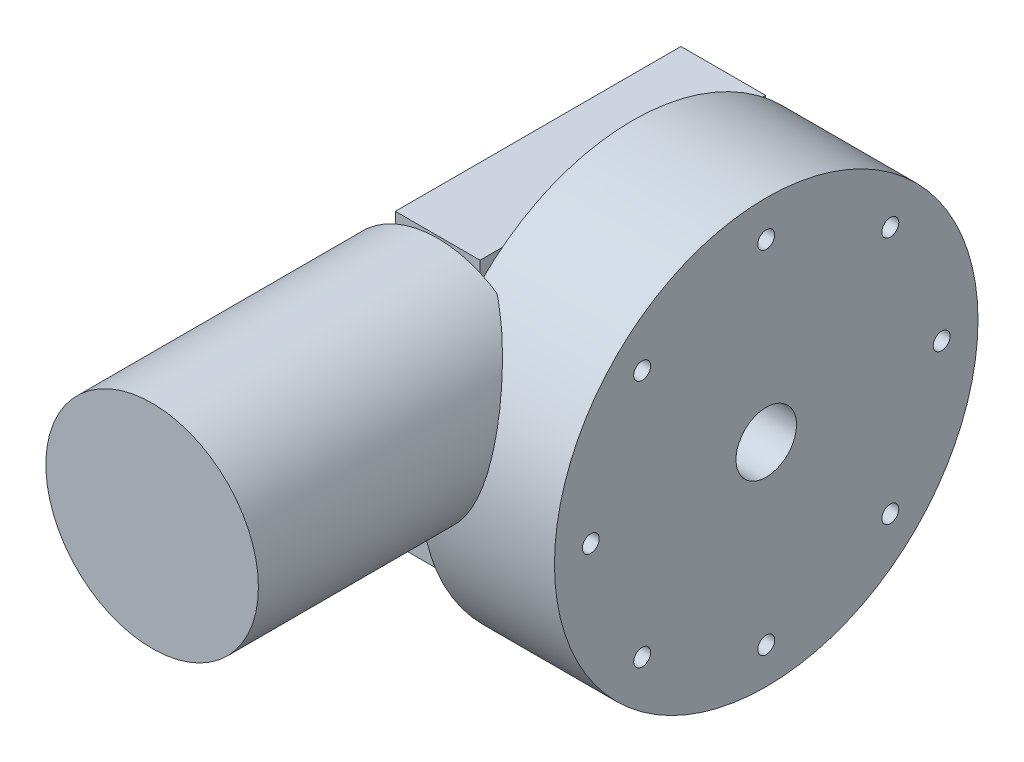
ISO-10303-21;
HEADER;
FILE_DESCRIPTION(('STEP AP214'),'2;1');
FILE_NAME('part.step','',(''),(''),'','','');
FILE_SCHEMA(('AUTOMOTIVE_DESIGN { 1 0 10303 214 1 1 1 1 }'));
ENDSEC;
DATA;
#1=APPLICATION_CONTEXT('core data for automotive mechanical design processes');
#2=APPLICATION_PROTOCOL_DEFINITION('international standard','automotive_design',2000,#1);
#3=PRODUCT_CONTEXT('',#1,'mechanical');
#4=PRODUCT('Part','Part','',(#3));
#5=PRODUCT_RELATED_PRODUCT_CATEGORY('part','',(#4));
#6=PRODUCT_DEFINITION_FORMATION('','',#4);
#7=PRODUCT_DEFINITION_CONTEXT('part definition',#1,'design');
#8=PRODUCT_DEFINITION('design','',#6,#7);
#9=PRODUCT_DEFINITION_SHAPE('','',#8);
#10=(LENGTH_UNIT() NAMED_UNIT(*) SI_UNIT(.MILLI.,.METRE.));
#11=(NAMED_UNIT(*) PLANE_ANGLE_UNIT() SI_UNIT($,.RADIAN.));
#12=(NAMED_UNIT(*) SI_UNIT($,.STERADIAN.) SOLID_ANGLE_UNIT());
#13=UNCERTAINTY_MEASURE_WITH_UNIT(LENGTH_MEASURE(1.E-05),#10,'distance_accuracy_value','');
#14=(GEOMETRIC_REPRESENTATION_CONTEXT(3) GLOBAL_UNCERTAINTY_ASSIGNED_CONTEXT((#13)) GLOBAL_UNIT_ASSIGNED_CONTEXT((#10,
#11,#12)) REPRESENTATION_CONTEXT('',''));
#15=CARTESIAN_POINT('',(0.,0.,0.));
#16=DIRECTION('',(0.,0.,1.));
#17=DIRECTION('',(1.,0.,0.));
#18=AXIS2_PLACEMENT_3D('',#15,#16,#17);
#19=CARTESIAN_POINT('',(-70.,-100.523478567222,126.));
#20=DIRECTION('',(0.,0.,1.));
#21=DIRECTION('',(1.,0.,0.));
#22=AXIS2_PLACEMENT_3D('',#19,#20,#21);
#23=PLANE('',#22);
#24=CARTESIAN_POINT('',(-35.,48.3972012518398,126.));
#25=DIRECTION('',(0.,0.,1.));
#26=DIRECTION('',(1.,0.,0.));
#27=AXIS2_PLACEMENT_3D('',#24,#25,#26);
#28=CIRCLE('',#27,87.8280680463615);
#29=CARTESIAN_POINT('',(0.,128.950100248439,126.));
#30=VERTEX_POINT('',#29);
#31=CARTESIAN_POINT('',(-70.,128.950100248439,126.));
#32=VERTEX_POINT('',#31);
#33=EDGE_CURVE('E53',#30,#32,#28,.T.);
#34=ORIENTED_EDGE('',*,*,#33,.F.);
#35=DIRECTION('',(0.,-1.,0.));
#36=VECTOR('',#35,1.);
#37=CARTESIAN_POINT('',(0.,-100.523478567222,126.));
#38=LINE('',#37,#36);
#39=CARTESIAN_POINT('',(0.,138.,126.));
#40=VERTEX_POINT('',#39);
#41=EDGE_CURVE('E107',#40,#30,#38,.T.);
#42=ORIENTED_EDGE('',*,*,#41,.F.);
#43=DIRECTION('',(1.,0.,0.));
#44=VECTOR('',#43,1.);
#45=CARTESIAN_POINT('',(-70.,138.,126.));
#46=LINE('',#45,#44);
#47=CARTESIAN_POINT('',(-70.,138.,126.));
#48=VERTEX_POINT('',#47);
#49=EDGE_CURVE('E150',#48,#40,#46,.T.);
#50=ORIENTED_EDGE('',*,*,#49,.F.);
#51=DIRECTION('',(0.,-1.,0.));
#52=VECTOR('',#51,1.);
#53=CARTESIAN_POINT('',(-70.,-100.523478567222,126.));
#54=LINE('',#53,#52);
#55=EDGE_CURVE('E138',#48,#32,#54,.T.);
#56=ORIENTED_EDGE('',*,*,#55,.T.);
#57=EDGE_LOOP('',(#34,#42,#50,#56));
#58=FACE_BOUND('',#57,.T.);
#59=ADVANCED_FACE('F42',(#58),#23,.T.);
#60=CARTESIAN_POINT('',(-70.,-100.523478567222,-110.));
#61=DIRECTION('',(0.,0.,-1.));
#62=DIRECTION('',(-1.,0.,0.));
#63=AXIS2_PLACEMENT_3D('',#60,#61,#62);
#64=PLANE('',#63);
#65=DIRECTION('',(0.,1.,0.));
#66=VECTOR('',#65,1.);
#67=CARTESIAN_POINT('',(0.,-100.523478567222,-110.));
#68=LINE('',#67,#66);
#69=CARTESIAN_POINT('',(0.,-100.523478567222,-110.));
#70=VERTEX_POINT('',#69);
#71=CARTESIAN_POINT('',(0.,138.,-110.));
#72=VERTEX_POINT('',#71);
#73=EDGE_CURVE('E144',#70,#72,#68,.T.);
#74=ORIENTED_EDGE('',*,*,#73,.F.);
#75=DIRECTION('',(1.,0.,0.));
#76=VECTOR('',#75,1.);
#77=CARTESIAN_POINT('',(-70.,-100.523478567222,-110.));
#78=LINE('',#77,#76);
#79=CARTESIAN_POINT('',(-70.,-100.523478567222,-110.));
#80=VERTEX_POINT('',#79);
#81=EDGE_CURVE('E51',#80,#70,#78,.T.);
#82=ORIENTED_EDGE('',*,*,#81,.F.);
#83=DIRECTION('',(0.,1.,0.));
#84=VECTOR('',#83,1.);
#85=CARTESIAN_POINT('',(-70.,-100.523478567222,-110.));
#86=LINE('',#85,#84);
#87=CARTESIAN_POINT('',(-70.,138.,-110.));
#88=VERTEX_POINT('',#87);
#89=EDGE_CURVE('E130',#80,#88,#86,.T.);
#90=ORIENTED_EDGE('',*,*,#89,.T.);
#91=DIRECTION('',(1.,0.,0.));
#92=VECTOR('',#91,1.);
#93=CARTESIAN_POINT('',(-70.,138.,-110.));
#94=LINE('',#93,#92);
#95=EDGE_CURVE('E143',#88,#72,#94,.T.);
#96=ORIENTED_EDGE('',*,*,#95,.T.);
#97=EDGE_LOOP('',(#74,#82,#90,#96));
#98=FACE_BOUND('',#97,.T.);
#99=ADVANCED_FACE('F44',(#98),#64,.T.);
#100=CARTESIAN_POINT('',(-70.,-100.523478567222,-110.));
#101=DIRECTION('',(0.,-1.,0.));
#102=DIRECTION('',(0.,0.,-1.));
#103=AXIS2_PLACEMENT_3D('',#100,#101,#102);
#104=PLANE('',#103);
#105=DIRECTION('',(0.,0.,-1.));
#106=VECTOR('',#105,1.);
#107=CARTESIAN_POINT('',(0.,-100.523478567222,-110.));
#108=LINE('',#107,#106);
#109=CARTESIAN_POINT('',(0.,-100.523478567222,126.));
#110=VERTEX_POINT('',#109);
#111=EDGE_CURVE('E134',#110,#70,#108,.T.);
#112=ORIENTED_EDGE('',*,*,#111,.F.);
#113=DIRECTION('',(1.,0.,0.));
#114=VECTOR('',#113,1.);
#115=CARTESIAN_POINT('',(-70.,-100.523478567222,126.));
#116=LINE('',#115,#114);
#117=CARTESIAN_POINT('',(-70.,-100.523478567222,126.));
#118=VERTEX_POINT('',#117);
#119=EDGE_CURVE('E114',#118,#110,#116,.T.);
#120=ORIENTED_EDGE('',*,*,#119,.F.);
#121=DIRECTION('',(0.,0.,-1.));
#122=VECTOR('',#121,1.);
#123=CARTESIAN_POINT('',(-70.,-100.523478567222,-110.));
#124=LINE('',#123,#122);
#125=EDGE_CURVE('E140',#118,#80,#124,.T.);
#126=ORIENTED_EDGE('',*,*,#125,.T.);
#127=ORIENTED_EDGE('',*,*,#81,.T.);
#128=EDGE_LOOP('',(#112,#120,#126,#127));
#129=FACE_BOUND('',#128,.T.);
#130=ADVANCED_FACE('F159',(#129),#104,.T.);
#131=CARTESIAN_POINT('',(-70.,-32.1556977447593,126.));
#132=VERTEX_POINT('',#131);
#133=CARTESIAN_POINT('',(0.,-32.1556977447593,126.));
#134=VERTEX_POINT('',#133);
#135=EDGE_CURVE('E12',#132,#134,#28,.T.);
#136=ORIENTED_EDGE('',*,*,#135,.F.);
#137=EDGE_CURVE('E137',#132,#118,#54,.T.);
#138=ORIENTED_EDGE('',*,*,#137,.T.);
#139=ORIENTED_EDGE('',*,*,#119,.T.);
#140=EDGE_CURVE('E103',#134,#110,#38,.T.);
#141=ORIENTED_EDGE('',*,*,#140,.F.);
#142=EDGE_LOOP('',(#136,#138,#139,#141));
#143=FACE_BOUND('',#142,.T.);
#144=ADVANCED_FACE('F112',(#143),#23,.T.);
#145=CARTESIAN_POINT('',(-70.,138.,-110.));
#146=DIRECTION('',(0.,1.,0.));
#147=DIRECTION('',(0.,0.,1.));
#148=AXIS2_PLACEMENT_3D('',#145,#146,#147);
#149=PLANE('',#148);
#150=DIRECTION('',(0.,0.,1.));
#151=VECTOR('',#150,1.);
#152=CARTESIAN_POINT('',(0.,138.,-110.));
#153=LINE('',#152,#151);
#154=EDGE_CURVE('E116',#72,#40,#153,.T.);
#155=ORIENTED_EDGE('',*,*,#154,.F.);
#156=ORIENTED_EDGE('',*,*,#95,.F.);
#157=DIRECTION('',(0.,0.,1.));
#158=VECTOR('',#157,1.);
#159=CARTESIAN_POINT('',(-70.,138.,-110.));
#160=LINE('',#159,#158);
#161=EDGE_CURVE('E133',#88,#48,#160,.T.);
#162=ORIENTED_EDGE('',*,*,#161,.T.);
#163=ORIENTED_EDGE('',*,*,#49,.T.);
#164=EDGE_LOOP('',(#155,#156,#162,#163));
#165=FACE_BOUND('',#164,.T.);
#166=ADVANCED_FACE('F157',(#165),#149,.T.);
#167=CARTESIAN_POINT('',(-70.,0.,0.));
#168=DIRECTION('',(1.,0.,0.));
#169=DIRECTION('',(0.,0.,-1.));
#170=AXIS2_PLACEMENT_3D('',#167,#168,#169);
#171=PLANE('',#170);
#172=CARTESIAN_POINT('',(-70.,0.,0.));
#173=DIRECTION('',(1.,0.,0.));
#174=DIRECTION('',(0.,0.,-1.));
#175=AXIS2_PLACEMENT_3D('',#172,#173,#174);
#176=CIRCLE('',#175,25.);
#177=CARTESIAN_POINT('',(-70.,0.,-25.));
#178=VERTEX_POINT('',#177);
#179=EDGE_CURVE('E121',#178,#178,#176,.T.);
#180=ORIENTED_EDGE('',*,*,#179,.T.);
#181=EDGE_LOOP('',(#180));
#182=FACE_BOUND('',#181,.T.);
#183=ORIENTED_EDGE('',*,*,#89,.F.);
#184=ORIENTED_EDGE('',*,*,#125,.F.);
#185=ORIENTED_EDGE('',*,*,#137,.F.);
#186=EDGE_CURVE('E66',#32,#132,#54,.T.);
#187=ORIENTED_EDGE('',*,*,#186,.F.);
#188=ORIENTED_EDGE('',*,*,#55,.F.);
#189=ORIENTED_EDGE('',*,*,#161,.F.);
#190=EDGE_LOOP('',(#183,#184,#185,#187,#188,#189));
#191=FACE_BOUND('',#190,.T.);
#192=ADVANCED_FACE('F161',(#182,#191),#171,.F.);
#193=CARTESIAN_POINT('',(0.,0.,0.));
#194=DIRECTION('',(1.,0.,0.));
#195=DIRECTION('',(0.,0.,-1.));
#196=AXIS2_PLACEMENT_3D('',#193,#194,#195);
#197=PLANE('',#196);
#198=CARTESIAN_POINT('',(0.,0.,0.));
#199=DIRECTION('',(1.,0.,0.));
#200=DIRECTION('',(0.,0.,-1.));
#201=AXIS2_PLACEMENT_3D('',#198,#199,#200);
#202=CIRCLE('',#201,25.);
#203=CARTESIAN_POINT('',(0.,0.,-25.));
#204=VERTEX_POINT('',#203);
#205=EDGE_CURVE('E46',#204,#204,#202,.T.);
#206=ORIENTED_EDGE('',*,*,#205,.F.);
#207=EDGE_LOOP('',(#206));
#208=FACE_BOUND('',#207,.T.);
#209=ORIENTED_EDGE('',*,*,#73,.T.);
#210=ORIENTED_EDGE('',*,*,#154,.T.);
#211=ORIENTED_EDGE('',*,*,#41,.T.);
#212=EDGE_CURVE('E99',#30,#134,#38,.T.);
#213=ORIENTED_EDGE('',*,*,#212,.T.);
#214=ORIENTED_EDGE('',*,*,#140,.T.);
#215=ORIENTED_EDGE('',*,*,#111,.T.);
#216=EDGE_LOOP('',(#209,#210,#211,#213,#214,#215));
#217=FACE_BOUND('',#216,.T.);
#218=ADVANCED_FACE('F101',(#208,#217),#197,.T.);
#219=CARTESIAN_POINT('',(-35.,48.3972012518398,126.));
#220=DIRECTION('',(0.,0.,1.));
#221=DIRECTION('',(1.,0.,0.));
#222=AXIS2_PLACEMENT_3D('',#219,#220,#221);
#223=PLANE('',#222);
#224=EDGE_CURVE('E54',#32,#132,#28,.T.);
#225=ORIENTED_EDGE('',*,*,#224,.F.);
#226=ORIENTED_EDGE('',*,*,#186,.T.);
#227=EDGE_LOOP('',(#225,#226));
#228=FACE_BOUND('',#227,.T.);
#229=ADVANCED_FACE('F179',(#228),#223,.F.);
#230=CARTESIAN_POINT('',(-35.,48.3972012518398,362.));
#231=DIRECTION('',(0.,0.,-1.));
#232=DIRECTION('',(-1.,0.,0.));
#233=AXIS2_PLACEMENT_3D('',#230,#231,#232);
#234=CYLINDRICAL_SURFACE('',#233,87.8280680463615);
#235=CARTESIAN_POINT('',(-35.,48.3972012518398,362.));
#236=DIRECTION('',(0.,0.,1.));
#237=DIRECTION('',(1.,0.,0.));
#238=AXIS2_PLACEMENT_3D('',#235,#236,#237);
#239=CIRCLE('',#238,87.8280680463615);
#240=CARTESIAN_POINT('',(52.8280680463615,48.3972012518398,362.));
#241=VERTEX_POINT('',#240);
#242=EDGE_CURVE('E126',#241,#241,#239,.T.);
#243=ORIENTED_EDGE('',*,*,#242,.F.);
#244=EDGE_LOOP('',(#243));
#245=FACE_BOUND('',#244,.T.);
#246=ORIENTED_EDGE('',*,*,#33,.T.);
#247=ORIENTED_EDGE('',*,*,#224,.T.);
#248=ORIENTED_EDGE('',*,*,#135,.T.);
#249=EDGE_CURVE('E117',#134,#30,#28,.T.);
#250=ORIENTED_EDGE('',*,*,#249,.T.);
#251=EDGE_LOOP('',(#246,#247,#248,#250));
#252=FACE_BOUND('',#251,.T.);
#253=ADVANCED_FACE('F123',(#245,#252),#234,.T.);
#254=CARTESIAN_POINT('',(-35.,48.3972012518398,362.));
#255=DIRECTION('',(0.,0.,1.));
#256=DIRECTION('',(1.,0.,0.));
#257=AXIS2_PLACEMENT_3D('',#254,#255,#256);
#258=PLANE('',#257);
#259=ORIENTED_EDGE('',*,*,#242,.T.);
#260=EDGE_LOOP('',(#259));
#261=FACE_BOUND('',#260,.T.);
#262=ADVANCED_FACE('F186',(#261),#258,.T.);
#263=ORIENTED_EDGE('',*,*,#212,.F.);
#264=ORIENTED_EDGE('',*,*,#249,.F.);
#265=EDGE_LOOP('',(#263,#264));
#266=FACE_BOUND('',#265,.T.);
#267=ADVANCED_FACE('F118',(#266),#223,.F.);
#268=CARTESIAN_POINT('',(-122.828068046361,0.,0.));
#269=DIRECTION('',(1.,0.,0.));
#270=DIRECTION('',(0.,0.,-1.));
#271=AXIS2_PLACEMENT_3D('',#268,#269,#270);
#272=CYLINDRICAL_SURFACE('',#271,25.);
#273=CARTESIAN_POINT('',(0.,0.,-25.));
#274=CARTESIAN_POINT('',(-0.729166666666665,0.,-25.));
#275=CARTESIAN_POINT('',(-1.45833333333333,0.,-25.));
#276=CARTESIAN_POINT('',(-2.91666666666666,0.,-25.));
#277=CARTESIAN_POINT('',(-3.64583333333333,0.,-25.));
#278=CARTESIAN_POINT('',(-5.10416666666667,0.,-25.));
#279=CARTESIAN_POINT('',(-5.83333333333333,0.,-25.));
#280=CARTESIAN_POINT('',(-7.29166666666667,0.,-25.));
#281=CARTESIAN_POINT('',(-8.02083333333334,0.,-25.));
#282=CARTESIAN_POINT('',(-9.47916666666667,0.,-25.));
#283=CARTESIAN_POINT('',(-10.2083333333333,0.,-25.));
#284=CARTESIAN_POINT('',(-11.6666666666667,0.,-25.));
#285=CARTESIAN_POINT('',(-12.3958333333333,0.,-25.));
#286=CARTESIAN_POINT('',(-13.8541666666667,0.,-25.));
#287=CARTESIAN_POINT('',(-14.5833333333333,0.,-25.));
#288=CARTESIAN_POINT('',(-16.0416666666667,0.,-25.));
#289=CARTESIAN_POINT('',(-16.7708333333333,0.,-25.));
#290=CARTESIAN_POINT('',(-18.2291666666667,0.,-25.));
#291=CARTESIAN_POINT('',(-18.9583333333333,0.,-25.));
#292=CARTESIAN_POINT('',(-20.4166666666667,0.,-25.));
#293=CARTESIAN_POINT('',(-21.1458333333333,0.,-25.));
#294=CARTESIAN_POINT('',(-22.6041666666667,0.,-25.));
#295=CARTESIAN_POINT('',(-23.3333333333333,0.,-25.));
#296=CARTESIAN_POINT('',(-24.7916666666667,0.,-25.));
#297=CARTESIAN_POINT('',(-25.5208333333333,0.,-25.));
#298=CARTESIAN_POINT('',(-26.9791666666667,0.,-25.));
#299=CARTESIAN_POINT('',(-27.7083333333333,0.,-25.));
#300=CARTESIAN_POINT('',(-29.1666666666667,0.,-25.));
#301=CARTESIAN_POINT('',(-29.8958333333333,0.,-25.));
#302=CARTESIAN_POINT('',(-31.3541666666667,0.,-25.));
#303=CARTESIAN_POINT('',(-32.0833333333333,0.,-25.));
#304=CARTESIAN_POINT('',(-33.5416666666667,0.,-25.));
#305=CARTESIAN_POINT('',(-34.2708333333333,0.,-25.));
#306=CARTESIAN_POINT('',(-35.7291666666667,0.,-25.));
#307=CARTESIAN_POINT('',(-36.4583333333333,0.,-25.));
#308=CARTESIAN_POINT('',(-37.9166666666667,0.,-25.));
#309=CARTESIAN_POINT('',(-38.6458333333333,0.,-25.));
#310=CARTESIAN_POINT('',(-40.1041666666667,0.,-25.));
#311=CARTESIAN_POINT('',(-40.8333333333333,0.,-25.));
#312=CARTESIAN_POINT('',(-42.2916666666667,0.,-25.));
#313=CARTESIAN_POINT('',(-43.0208333333333,0.,-25.));
#314=CARTESIAN_POINT('',(-44.4791666666667,0.,-25.));
#315=CARTESIAN_POINT('',(-45.2083333333333,0.,-25.));
#316=CARTESIAN_POINT('',(-46.6666666666667,0.,-25.));
#317=CARTESIAN_POINT('',(-47.3958333333333,0.,-25.));
#318=CARTESIAN_POINT('',(-48.8541666666667,0.,-25.));
#319=CARTESIAN_POINT('',(-49.5833333333333,0.,-25.));
#320=CARTESIAN_POINT('',(-51.0416666666667,0.,-25.));
#321=CARTESIAN_POINT('',(-51.7708333333333,0.,-25.));
#322=CARTESIAN_POINT('',(-53.2291666666667,0.,-25.));
#323=CARTESIAN_POINT('',(-53.9583333333333,0.,-25.));
#324=CARTESIAN_POINT('',(-55.4166666666667,0.,-25.));
#325=CARTESIAN_POINT('',(-56.1458333333333,0.,-25.));
#326=CARTESIAN_POINT('',(-57.6041666666667,0.,-25.));
#327=CARTESIAN_POINT('',(-58.3333333333333,0.,-25.));
#328=CARTESIAN_POINT('',(-59.7916666666667,0.,-25.));
#329=CARTESIAN_POINT('',(-60.5208333333333,0.,-25.));
#330=CARTESIAN_POINT('',(-61.9791666666667,0.,-25.));
#331=CARTESIAN_POINT('',(-62.7083333333333,0.,-25.));
#332=CARTESIAN_POINT('',(-64.1666666666667,0.,-25.));
#333=CARTESIAN_POINT('',(-64.8958333333333,0.,-25.));
#334=CARTESIAN_POINT('',(-66.3541666666667,0.,-25.));
#335=CARTESIAN_POINT('',(-67.0833333333334,0.,-25.));
#336=CARTESIAN_POINT('',(-68.5416666666667,0.,-25.));
#337=CARTESIAN_POINT('',(-69.2708333333334,0.,-25.));
#338=CARTESIAN_POINT('',(-70.,0.,-25.));
#339=B_SPLINE_CURVE_WITH_KNOTS('',3,(#273,#274,#275,#276,#277,#278,#279,#280,#281,#282,#283,
#284,#285,#286,#287,#288,#289,#290,#291,#292,#293,#294,#295,#296,#297,#298,#299,#300,#301,#302,
#303,#304,#305,#306,#307,#308,#309,#310,#311,#312,#313,#314,#315,#316,#317,#318,#319,#320,#321,
#322,#323,#324,#325,#326,#327,#328,#329,#330,#331,#332,#333,#334,#335,#336,#337,#338),
.UNSPECIFIED.,.F.,.F.,(4,2,2,2,2,2,2,2,2,2,2,2,2,2,2,2,2,2,2,2,2,2,2,2,2,2,2,2,2,2,2,2,4),(0.,
2.1875,4.375,6.5625,8.75000000000001,10.9375,13.125,15.3125,17.5,19.6875,21.875,24.0625,26.25,
28.4375,30.625,32.8125,35.,37.1875,39.375,41.5625,43.75,45.9375,48.125,50.3125,52.5,54.6875,
56.875,59.0625,61.25,63.4375,65.625,67.8125,70.),.UNSPECIFIED.);
#340=EDGE_CURVE('BSEAM190',#204,#178,#339,.T.);
#341=ORIENTED_EDGE('',*,*,#205,.T.);
#342=ORIENTED_EDGE('',*,*,#179,.F.);
#343=ORIENTED_EDGE('',*,*,#340,.T.);
#344=ORIENTED_EDGE('',*,*,#340,.F.);
#345=EDGE_LOOP('',(#341,#343,#342,#344));
#346=FACE_BOUND('',#345,.T.);
#347=ADVANCED_FACE('F190',(#346),#272,.F.);
#348=CLOSED_SHELL('',(#59,#99,#130,#144,#166,#192,#218,#229,#253,#262,#267,#347));
#349=MANIFOLD_SOLID_BREP('B2',#348);
#350=CARTESIAN_POINT('',(110.5,0.,0.));
#351=DIRECTION('',(-1.,0.,0.));
#352=DIRECTION('',(0.,0.,1.));
#353=AXIS2_PLACEMENT_3D('',#350,#351,#352);
#354=CYLINDRICAL_SURFACE('',#353,175.);
#355=CARTESIAN_POINT('',(110.5,0.,0.));
#356=DIRECTION('',(1.,0.,0.));
#357=DIRECTION('',(0.,0.,-1.));
#358=AXIS2_PLACEMENT_3D('',#355,#356,#357);
#359=CIRCLE('',#358,175.);
#360=CARTESIAN_POINT('',(110.5,0.,-175.));
#361=VERTEX_POINT('',#360);
#362=EDGE_CURVE('E41',#361,#361,#359,.T.);
#363=ORIENTED_EDGE('',*,*,#362,.F.);
#364=EDGE_LOOP('',(#363));
#365=FACE_BOUND('',#364,.T.);
#366=CARTESIAN_POINT('',(0.,0.,0.));
#367=DIRECTION('',(1.,0.,0.));
#368=DIRECTION('',(0.,0.,-1.));
#369=AXIS2_PLACEMENT_3D('',#366,#367,#368);
#370=CIRCLE('',#369,175.);
#371=CARTESIAN_POINT('',(0.,0.,-175.));
#372=VERTEX_POINT('',#371);
#373=EDGE_CURVE('E279',#372,#372,#370,.T.);
#374=ORIENTED_EDGE('',*,*,#373,.T.);
#375=EDGE_LOOP('',(#374));
#376=FACE_BOUND('',#375,.T.);
#377=ADVANCED_FACE('F272',(#365,#376),#354,.T.);
#378=CARTESIAN_POINT('',(110.5,0.,0.));
#379=DIRECTION('',(1.,0.,0.));
#380=DIRECTION('',(0.,0.,-1.));
#381=AXIS2_PLACEMENT_3D('',#378,#379,#380);
#382=PLANE('',#381);
#383=CARTESIAN_POINT('',(110.5,0.,0.));
#384=DIRECTION('',(1.,0.,0.));
#385=DIRECTION('',(0.,0.,-1.));
#386=AXIS2_PLACEMENT_3D('',#383,#384,#385);
#387=CIRCLE('',#386,25.);
#388=CARTESIAN_POINT('',(110.5,0.,-25.));
#389=VERTEX_POINT('',#388);
#390=EDGE_CURVE('E333',#389,#389,#387,.T.);
#391=ORIENTED_EDGE('',*,*,#390,.F.);
#392=EDGE_LOOP('',(#391));
#393=FACE_BOUND('',#392,.T.);
#394=CARTESIAN_POINT('',(110.5,-5.06264794132254E-13,145.));
#395=DIRECTION('',(-1.,0.,0.));
#396=DIRECTION('',(0.,-1.,0.));
#397=AXIS2_PLACEMENT_3D('',#394,#395,#396);
#398=CIRCLE('',#397,7.);
#399=CARTESIAN_POINT('',(110.5,-7.00000000000051,145.));
#400=VERTEX_POINT('',#399);
#401=EDGE_CURVE('E295',#400,#400,#398,.T.);
#402=ORIENTED_EDGE('',*,*,#401,.T.);
#403=EDGE_LOOP('',(#402));
#404=FACE_BOUND('',#403,.T.);
#405=CARTESIAN_POINT('',(110.5,-102.53048327205,102.530483272049));
#406=DIRECTION('',(-1.,0.,0.));
#407=DIRECTION('',(0.,-0.707106781186544,-0.707106781186551));
#408=AXIS2_PLACEMENT_3D('',#405,#406,#407);
#409=CIRCLE('',#408,7.);
#410=CARTESIAN_POINT('',(110.5,-107.480230740356,97.580735803743));
#411=VERTEX_POINT('',#410);
#412=EDGE_CURVE('E314',#411,#411,#409,.T.);
#413=ORIENTED_EDGE('',*,*,#412,.T.);
#414=EDGE_LOOP('',(#413));
#415=FACE_BOUND('',#414,.T.);
#416=CARTESIAN_POINT('',(110.5,-145.,0.));
#417=DIRECTION('',(-1.,0.,0.));
#418=DIRECTION('',(0.,0.,-1.));
#419=AXIS2_PLACEMENT_3D('',#416,#417,#418);
#420=CIRCLE('',#419,7.);
#421=CARTESIAN_POINT('',(110.5,-145.,-7.));
#422=VERTEX_POINT('',#421);
#423=EDGE_CURVE('E308',#422,#422,#420,.T.);
#424=ORIENTED_EDGE('',*,*,#423,.T.);
#425=EDGE_LOOP('',(#424));
#426=FACE_BOUND('',#425,.T.);
#427=CARTESIAN_POINT('',(110.5,-102.530483272048,-102.53048327205));
#428=DIRECTION('',(-1.,0.,0.));
#429=DIRECTION('',(0.,0.707106781186554,-0.707106781186541));
#430=AXIS2_PLACEMENT_3D('',#427,#428,#429);
#431=CIRCLE('',#430,7.);
#432=CARTESIAN_POINT('',(110.5,-97.5807358037426,-107.480230740356));
#433=VERTEX_POINT('',#432);
#434=EDGE_CURVE('E301',#433,#433,#431,.T.);
#435=ORIENTED_EDGE('',*,*,#434,.T.);
#436=EDGE_LOOP('',(#435));
#437=FACE_BOUND('',#436,.T.);
#438=CARTESIAN_POINT('',(110.5,1.51879438239676E-12,-145.));
#439=DIRECTION('',(-1.,0.,0.));
#440=DIRECTION('',(0.,1.,0.));
#441=AXIS2_PLACEMENT_3D('',#438,#439,#440);
#442=CIRCLE('',#441,7.);
#443=CARTESIAN_POINT('',(110.5,7.00000000000152,-145.));
#444=VERTEX_POINT('',#443);
#445=EDGE_CURVE('E302',#444,#444,#442,.T.);
#446=ORIENTED_EDGE('',*,*,#445,.T.);
#447=EDGE_LOOP('',(#446));
#448=FACE_BOUND('',#447,.T.);
#449=CARTESIAN_POINT('',(110.5,102.530483272051,-102.530483272048));
#450=DIRECTION('',(-1.,0.,0.));
#451=DIRECTION('',(0.,0.707106781186539,0.707106781186556));
#452=AXIS2_PLACEMENT_3D('',#449,#450,#451);
#453=CIRCLE('',#452,7.);
#454=CARTESIAN_POINT('',(110.5,107.480230740356,-97.5807358037422));
#455=VERTEX_POINT('',#454);
#456=EDGE_CURVE('E325',#455,#455,#453,.T.);
#457=ORIENTED_EDGE('',*,*,#456,.T.);
#458=EDGE_LOOP('',(#457));
#459=FACE_BOUND('',#458,.T.);
#460=CARTESIAN_POINT('',(110.5,102.530483272049,102.53048327205));
#461=DIRECTION('',(-1.,0.,0.));
#462=DIRECTION('',(0.,-0.707106781186549,0.707106781186546));
#463=AXIS2_PLACEMENT_3D('',#460,#461,#462);
#464=CIRCLE('',#463,7.);
#465=CARTESIAN_POINT('',(110.5,97.5807358037434,107.480230740355));
#466=VERTEX_POINT('',#465);
#467=EDGE_CURVE('E289',#466,#466,#464,.T.);
#468=ORIENTED_EDGE('',*,*,#467,.T.);
#469=EDGE_LOOP('',(#468));
#470=FACE_BOUND('',#469,.T.);
#471=CARTESIAN_POINT('',(110.5,145.,0.));
#472=DIRECTION('',(-1.,0.,0.));
#473=DIRECTION('',(0.,0.,1.));
#474=AXIS2_PLACEMENT_3D('',#471,#472,#473);
#475=CIRCLE('',#474,7.);
#476=CARTESIAN_POINT('',(110.5,145.,7.));
#477=VERTEX_POINT('',#476);
#478=EDGE_CURVE('E284',#477,#477,#475,.T.);
#479=ORIENTED_EDGE('',*,*,#478,.T.);
#480=EDGE_LOOP('',(#479));
#481=FACE_BOUND('',#480,.T.);
#482=ORIENTED_EDGE('',*,*,#362,.T.);
#483=EDGE_LOOP('',(#482));
#484=FACE_BOUND('',#483,.T.);
#485=ADVANCED_FACE('F355',(#393,#404,#415,#426,#437,#448,#459,#470,#481,#484),#382,.T.);
#486=CARTESIAN_POINT('',(0.,0.,0.));
#487=DIRECTION('',(1.,0.,0.));
#488=DIRECTION('',(0.,0.,-1.));
#489=AXIS2_PLACEMENT_3D('',#486,#487,#488);
#490=PLANE('',#489);
#491=CARTESIAN_POINT('',(0.,0.,0.));
#492=DIRECTION('',(1.,0.,0.));
#493=DIRECTION('',(0.,0.,-1.));
#494=AXIS2_PLACEMENT_3D('',#491,#492,#493);
#495=CIRCLE('',#494,25.);
#496=CARTESIAN_POINT('',(0.,0.,-25.));
#497=VERTEX_POINT('',#496);
#498=EDGE_CURVE('E275',#497,#497,#495,.T.);
#499=ORIENTED_EDGE('',*,*,#498,.T.);
#500=EDGE_LOOP('',(#499));
#501=FACE_BOUND('',#500,.T.);
#502=CARTESIAN_POINT('',(0.,-5.06264794132254E-13,145.));
#503=DIRECTION('',(-1.,0.,0.));
#504=DIRECTION('',(0.,-1.,0.));
#505=AXIS2_PLACEMENT_3D('',#502,#503,#504);
#506=CIRCLE('',#505,7.);
#507=CARTESIAN_POINT('',(0.,-7.00000000000051,145.));
#508=VERTEX_POINT('',#507);
#509=EDGE_CURVE('E317',#508,#508,#506,.T.);
#510=ORIENTED_EDGE('',*,*,#509,.F.);
#511=EDGE_LOOP('',(#510));
#512=FACE_BOUND('',#511,.T.);
#513=CARTESIAN_POINT('',(0.,-102.53048327205,102.530483272049));
#514=DIRECTION('',(-1.,0.,0.));
#515=DIRECTION('',(0.,-0.707106781186544,-0.707106781186551));
#516=AXIS2_PLACEMENT_3D('',#513,#514,#515);
#517=CIRCLE('',#516,7.);
#518=CARTESIAN_POINT('',(0.,-107.480230740356,97.580735803743));
#519=VERTEX_POINT('',#518);
#520=EDGE_CURVE('E311',#519,#519,#517,.T.);
#521=ORIENTED_EDGE('',*,*,#520,.F.);
#522=EDGE_LOOP('',(#521));
#523=FACE_BOUND('',#522,.T.);
#524=CARTESIAN_POINT('',(0.,-145.,0.));
#525=DIRECTION('',(-1.,0.,0.));
#526=DIRECTION('',(0.,0.,-1.));
#527=AXIS2_PLACEMENT_3D('',#524,#525,#526);
#528=CIRCLE('',#527,7.);
#529=CARTESIAN_POINT('',(0.,-145.,-7.));
#530=VERTEX_POINT('',#529);
#531=EDGE_CURVE('E305',#530,#530,#528,.T.);
#532=ORIENTED_EDGE('',*,*,#531,.F.);
#533=EDGE_LOOP('',(#532));
#534=FACE_BOUND('',#533,.T.);
#535=CARTESIAN_POINT('',(0.,-102.530483272048,-102.53048327205));
#536=DIRECTION('',(-1.,0.,0.));
#537=DIRECTION('',(0.,0.707106781186554,-0.707106781186541));
#538=AXIS2_PLACEMENT_3D('',#535,#536,#537);
#539=CIRCLE('',#538,7.);
#540=CARTESIAN_POINT('',(0.,-97.5807358037426,-107.480230740356));
#541=VERTEX_POINT('',#540);
#542=EDGE_CURVE('E298',#541,#541,#539,.T.);
#543=ORIENTED_EDGE('',*,*,#542,.F.);
#544=EDGE_LOOP('',(#543));
#545=FACE_BOUND('',#544,.T.);
#546=CARTESIAN_POINT('',(0.,1.51879438239676E-12,-145.));
#547=DIRECTION('',(-1.,0.,0.));
#548=DIRECTION('',(0.,1.,0.));
#549=AXIS2_PLACEMENT_3D('',#546,#547,#548);
#550=CIRCLE('',#549,7.);
#551=CARTESIAN_POINT('',(0.,7.00000000000152,-145.));
#552=VERTEX_POINT('',#551);
#553=EDGE_CURVE('E328',#552,#552,#550,.T.);
#554=ORIENTED_EDGE('',*,*,#553,.F.);
#555=EDGE_LOOP('',(#554));
#556=FACE_BOUND('',#555,.T.);
#557=CARTESIAN_POINT('',(0.,102.530483272051,-102.530483272048));
#558=DIRECTION('',(-1.,0.,0.));
#559=DIRECTION('',(0.,0.707106781186539,0.707106781186556));
#560=AXIS2_PLACEMENT_3D('',#557,#558,#559);
#561=CIRCLE('',#560,7.);
#562=CARTESIAN_POINT('',(0.,107.480230740356,-97.5807358037422));
#563=VERTEX_POINT('',#562);
#564=EDGE_CURVE('E322',#563,#563,#561,.T.);
#565=ORIENTED_EDGE('',*,*,#564,.F.);
#566=EDGE_LOOP('',(#565));
#567=FACE_BOUND('',#566,.T.);
#568=CARTESIAN_POINT('',(0.,102.530483272049,102.53048327205));
#569=DIRECTION('',(-1.,0.,0.));
#570=DIRECTION('',(0.,-0.707106781186549,0.707106781186546));
#571=AXIS2_PLACEMENT_3D('',#568,#569,#570);
#572=CIRCLE('',#571,7.);
#573=CARTESIAN_POINT('',(0.,97.5807358037434,107.480230740355));
#574=VERTEX_POINT('',#573);
#575=EDGE_CURVE('E292',#574,#574,#572,.T.);
#576=ORIENTED_EDGE('',*,*,#575,.F.);
#577=EDGE_LOOP('',(#576));
#578=FACE_BOUND('',#577,.T.);
#579=CARTESIAN_POINT('',(0.,145.,0.));
#580=DIRECTION('',(-1.,0.,0.));
#581=DIRECTION('',(0.,0.,1.));
#582=AXIS2_PLACEMENT_3D('',#579,#580,#581);
#583=CIRCLE('',#582,7.);
#584=CARTESIAN_POINT('',(0.,145.,7.));
#585=VERTEX_POINT('',#584);
#586=EDGE_CURVE('E286',#585,#585,#583,.T.);
#587=ORIENTED_EDGE('',*,*,#586,.F.);
#588=EDGE_LOOP('',(#587));
#589=FACE_BOUND('',#588,.T.);
#590=ORIENTED_EDGE('',*,*,#373,.F.);
#591=EDGE_LOOP('',(#590));
#592=FACE_BOUND('',#591,.T.);
#593=ADVANCED_FACE('F340',(#501,#512,#523,#534,#545,#556,#567,#578,#589,#592),#490,.F.);
#594=CARTESIAN_POINT('',(110.5,145.,0.));
#595=DIRECTION('',(-1.,0.,0.));
#596=DIRECTION('',(0.,0.,1.));
#597=AXIS2_PLACEMENT_3D('',#594,#595,#596);
#598=CYLINDRICAL_SURFACE('',#597,7.);
#599=ORIENTED_EDGE('',*,*,#478,.F.);
#600=EDGE_LOOP('',(#599));
#601=FACE_BOUND('',#600,.T.);
#602=ORIENTED_EDGE('',*,*,#586,.T.);
#603=EDGE_LOOP('',(#602));
#604=FACE_BOUND('',#603,.T.);
#605=ADVANCED_FACE('F366',(#601,#604),#598,.F.);
#606=CARTESIAN_POINT('',(110.5,102.530483272049,102.53048327205));
#607=DIRECTION('',(-1.,0.,0.));
#608=DIRECTION('',(0.,0.,1.));
#609=AXIS2_PLACEMENT_3D('',#606,#607,#608);
#610=CYLINDRICAL_SURFACE('',#609,7.);
#611=ORIENTED_EDGE('',*,*,#467,.F.);
#612=EDGE_LOOP('',(#611));
#613=FACE_BOUND('',#612,.T.);
#614=ORIENTED_EDGE('',*,*,#575,.T.);
#615=EDGE_LOOP('',(#614));
#616=FACE_BOUND('',#615,.T.);
#617=ADVANCED_FACE('F370',(#613,#616),#610,.F.);
#618=CARTESIAN_POINT('',(110.5,102.530483272051,-102.530483272048));
#619=DIRECTION('',(-1.,0.,0.));
#620=DIRECTION('',(0.,0.,1.));
#621=AXIS2_PLACEMENT_3D('',#618,#619,#620);
#622=CYLINDRICAL_SURFACE('',#621,7.);
#623=ORIENTED_EDGE('',*,*,#456,.F.);
#624=EDGE_LOOP('',(#623));
#625=FACE_BOUND('',#624,.T.);
#626=ORIENTED_EDGE('',*,*,#564,.T.);
#627=EDGE_LOOP('',(#626));
#628=FACE_BOUND('',#627,.T.);
#629=ADVANCED_FACE('F376',(#625,#628),#622,.F.);
#630=CARTESIAN_POINT('',(110.5,1.51879438239676E-12,-145.));
#631=DIRECTION('',(-1.,0.,0.));
#632=DIRECTION('',(0.,0.,1.));
#633=AXIS2_PLACEMENT_3D('',#630,#631,#632);
#634=CYLINDRICAL_SURFACE('',#633,7.);
#635=ORIENTED_EDGE('',*,*,#445,.F.);
#636=EDGE_LOOP('',(#635));
#637=FACE_BOUND('',#636,.T.);
#638=ORIENTED_EDGE('',*,*,#553,.T.);
#639=EDGE_LOOP('',(#638));
#640=FACE_BOUND('',#639,.T.);
#641=ADVANCED_FACE('F382',(#637,#640),#634,.F.);
#642=CARTESIAN_POINT('',(110.5,-102.530483272048,-102.53048327205));
#643=DIRECTION('',(-1.,0.,0.));
#644=DIRECTION('',(0.,0.,1.));
#645=AXIS2_PLACEMENT_3D('',#642,#643,#644);
#646=CYLINDRICAL_SURFACE('',#645,7.);
#647=ORIENTED_EDGE('',*,*,#434,.F.);
#648=EDGE_LOOP('',(#647));
#649=FACE_BOUND('',#648,.T.);
#650=ORIENTED_EDGE('',*,*,#542,.T.);
#651=EDGE_LOOP('',(#650));
#652=FACE_BOUND('',#651,.T.);
#653=ADVANCED_FACE('F378',(#649,#652),#646,.F.);
#654=CARTESIAN_POINT('',(110.5,-145.,0.));
#655=DIRECTION('',(-1.,0.,0.));
#656=DIRECTION('',(0.,0.,1.));
#657=AXIS2_PLACEMENT_3D('',#654,#655,#656);
#658=CYLINDRICAL_SURFACE('',#657,7.);
#659=ORIENTED_EDGE('',*,*,#423,.F.);
#660=EDGE_LOOP('',(#659));
#661=FACE_BOUND('',#660,.T.);
#662=ORIENTED_EDGE('',*,*,#531,.T.);
#663=EDGE_LOOP('',(#662));
#664=FACE_BOUND('',#663,.T.);
#665=ADVANCED_FACE('F381',(#661,#664),#658,.F.);
#666=CARTESIAN_POINT('',(110.5,-102.53048327205,102.530483272049));
#667=DIRECTION('',(-1.,0.,0.));
#668=DIRECTION('',(0.,0.,1.));
#669=AXIS2_PLACEMENT_3D('',#666,#667,#668);
#670=CYLINDRICAL_SURFACE('',#669,7.);
#671=ORIENTED_EDGE('',*,*,#412,.F.);
#672=EDGE_LOOP('',(#671));
#673=FACE_BOUND('',#672,.T.);
#674=ORIENTED_EDGE('',*,*,#520,.T.);
#675=EDGE_LOOP('',(#674));
#676=FACE_BOUND('',#675,.T.);
#677=ADVANCED_FACE('F350',(#673,#676),#670,.F.);
#678=CARTESIAN_POINT('',(110.5,-5.06264794132254E-13,145.));
#679=DIRECTION('',(-1.,0.,0.));
#680=DIRECTION('',(0.,0.,1.));
#681=AXIS2_PLACEMENT_3D('',#678,#679,#680);
#682=CYLINDRICAL_SURFACE('',#681,7.);
#683=ORIENTED_EDGE('',*,*,#401,.F.);
#684=EDGE_LOOP('',(#683));
#685=FACE_BOUND('',#684,.T.);
#686=ORIENTED_EDGE('',*,*,#509,.T.);
#687=EDGE_LOOP('',(#686));
#688=FACE_BOUND('',#687,.T.);
#689=ADVANCED_FACE('F345',(#685,#688),#682,.F.);
#690=CARTESIAN_POINT('',(-122.828068046361,0.,0.));
#691=DIRECTION('',(1.,0.,0.));
#692=DIRECTION('',(0.,0.,-1.));
#693=AXIS2_PLACEMENT_3D('',#690,#691,#692);
#694=CYLINDRICAL_SURFACE('',#693,25.);
#695=CARTESIAN_POINT('',(110.5,0.,-25.));
#696=CARTESIAN_POINT('',(109.348958333333,0.,-25.));
#697=CARTESIAN_POINT('',(108.197916666667,0.,-25.));
#698=CARTESIAN_POINT('',(105.895833333333,0.,-25.));
#699=CARTESIAN_POINT('',(104.744791666667,0.,-25.));
#700=CARTESIAN_POINT('',(102.442708333333,0.,-25.));
#701=CARTESIAN_POINT('',(101.291666666667,0.,-25.));
#702=CARTESIAN_POINT('',(98.9895833333333,0.,-25.));
#703=CARTESIAN_POINT('',(97.8385416666666,0.,-25.));
#704=CARTESIAN_POINT('',(95.5364583333333,0.,-25.));
#705=CARTESIAN_POINT('',(94.3854166666666,0.,-25.));
#706=CARTESIAN_POINT('',(92.0833333333333,0.,-25.));
#707=CARTESIAN_POINT('',(90.9322916666666,0.,-25.));
#708=CARTESIAN_POINT('',(88.6302083333333,0.,-25.));
#709=CARTESIAN_POINT('',(87.4791666666666,0.,-25.));
#710=CARTESIAN_POINT('',(85.1770833333333,0.,-25.));
#711=CARTESIAN_POINT('',(84.0260416666666,0.,-25.));
#712=CARTESIAN_POINT('',(81.7239583333333,0.,-25.));
#713=CARTESIAN_POINT('',(80.5729166666666,0.,-25.));
#714=CARTESIAN_POINT('',(78.2708333333333,0.,-25.));
#715=CARTESIAN_POINT('',(77.1197916666666,0.,-25.));
#716=CARTESIAN_POINT('',(74.8177083333333,0.,-25.));
#717=CARTESIAN_POINT('',(73.6666666666666,0.,-25.));
#718=CARTESIAN_POINT('',(71.3645833333333,0.,-25.));
#719=CARTESIAN_POINT('',(70.2135416666667,0.,-25.));
#720=CARTESIAN_POINT('',(67.9114583333333,0.,-25.));
#721=CARTESIAN_POINT('',(66.7604166666667,0.,-25.));
#722=CARTESIAN_POINT('',(64.4583333333333,0.,-25.));
#723=CARTESIAN_POINT('',(63.3072916666667,0.,-25.));
#724=CARTESIAN_POINT('',(61.0052083333333,0.,-25.));
#725=CARTESIAN_POINT('',(59.8541666666666,0.,-25.));
#726=CARTESIAN_POINT('',(57.5520833333333,0.,-25.));
#727=CARTESIAN_POINT('',(56.4010416666666,0.,-25.));
#728=CARTESIAN_POINT('',(54.0989583333333,0.,-25.));
#729=CARTESIAN_POINT('',(52.9479166666666,0.,-25.));
#730=CARTESIAN_POINT('',(50.6458333333333,0.,-25.));
#731=CARTESIAN_POINT('',(49.4947916666666,0.,-25.));
#732=CARTESIAN_POINT('',(47.1927083333333,0.,-25.));
#733=CARTESIAN_POINT('',(46.0416666666666,0.,-25.));
#734=CARTESIAN_POINT('',(43.7395833333333,0.,-25.));
#735=CARTESIAN_POINT('',(42.5885416666666,0.,-25.));
#736=CARTESIAN_POINT('',(40.2864583333333,0.,-25.));
#737=CARTESIAN_POINT('',(39.1354166666667,0.,-25.));
#738=CARTESIAN_POINT('',(36.8333333333333,0.,-25.));
#739=CARTESIAN_POINT('',(35.6822916666667,0.,-25.));
#740=CARTESIAN_POINT('',(33.3802083333333,0.,-25.));
#741=CARTESIAN_POINT('',(32.2291666666667,0.,-25.));
#742=CARTESIAN_POINT('',(29.9270833333333,0.,-25.));
#743=CARTESIAN_POINT('',(28.7760416666667,0.,-25.));
#744=CARTESIAN_POINT('',(26.4739583333333,0.,-25.));
#745=CARTESIAN_POINT('',(25.3229166666667,0.,-25.));
#746=CARTESIAN_POINT('',(23.0208333333333,0.,-25.));
#747=CARTESIAN_POINT('',(21.8697916666667,0.,-25.));
#748=CARTESIAN_POINT('',(19.5677083333333,0.,-25.));
#749=CARTESIAN_POINT('',(18.4166666666667,0.,-25.));
#750=CARTESIAN_POINT('',(16.1145833333333,0.,-25.));
#751=CARTESIAN_POINT('',(14.9635416666667,0.,-25.));
#752=CARTESIAN_POINT('',(12.6614583333333,0.,-25.));
#753=CARTESIAN_POINT('',(11.5104166666667,0.,-25.));
#754=CARTESIAN_POINT('',(9.20833333333332,0.,-25.));
#755=CARTESIAN_POINT('',(8.05729166666666,0.,-25.));
#756=CARTESIAN_POINT('',(5.75520833333332,0.,-25.));
#757=CARTESIAN_POINT('',(4.60416666666665,0.,-25.));
#758=CARTESIAN_POINT('',(2.30208333333333,0.,-25.));
#759=CARTESIAN_POINT('',(1.15104166666666,0.,-25.));
#760=CARTESIAN_POINT('',(0.,0.,-25.));
#761=B_SPLINE_CURVE_WITH_KNOTS('',3,(#695,#696,#697,#698,#699,#700,#701,#702,#703,#704,#705,
#706,#707,#708,#709,#710,#711,#712,#713,#714,#715,#716,#717,#718,#719,#720,#721,#722,#723,#724,
#725,#726,#727,#728,#729,#730,#731,#732,#733,#734,#735,#736,#737,#738,#739,#740,#741,#742,#743,
#744,#745,#746,#747,#748,#749,#750,#751,#752,#753,#754,#755,#756,#757,#758,#759,#760),
.UNSPECIFIED.,.F.,.F.,(4,2,2,2,2,2,2,2,2,2,2,2,2,2,2,2,2,2,2,2,2,2,2,2,2,2,2,2,2,2,2,2,4),(0.,
3.453125,6.90625,10.359375,13.8125,17.265625,20.71875,24.171875,27.625,31.078125,34.53125,
37.984375,41.4375,44.890625,48.34375,51.796875,55.25,58.703125,62.15625,65.609375,69.0625,
72.515625,75.96875,79.421875,82.875,86.328125,89.78125,93.234375,96.6875,100.140625,103.59375,
107.046875,110.5),.UNSPECIFIED.);
#762=EDGE_CURVE('BSEAM343',#389,#497,#761,.T.);
#763=ORIENTED_EDGE('',*,*,#390,.T.);
#764=ORIENTED_EDGE('',*,*,#498,.F.);
#765=ORIENTED_EDGE('',*,*,#762,.T.);
#766=ORIENTED_EDGE('',*,*,#762,.F.);
#767=EDGE_LOOP('',(#763,#765,#764,#766));
#768=FACE_BOUND('',#767,.T.);
#769=ADVANCED_FACE('F343',(#768),#694,.F.);
#770=CLOSED_SHELL('',(#377,#485,#593,#605,#617,#629,#641,#653,#665,#677,#689,#769));
#771=MANIFOLD_SOLID_BREP('B6',#770);
#772=ADVANCED_BREP_SHAPE_REPRESENTATION('',(#18,#349,#771),#14);
#773=SHAPE_DEFINITION_REPRESENTATION(#9,#772);
ENDSEC;
END-ISO-10303-21;
